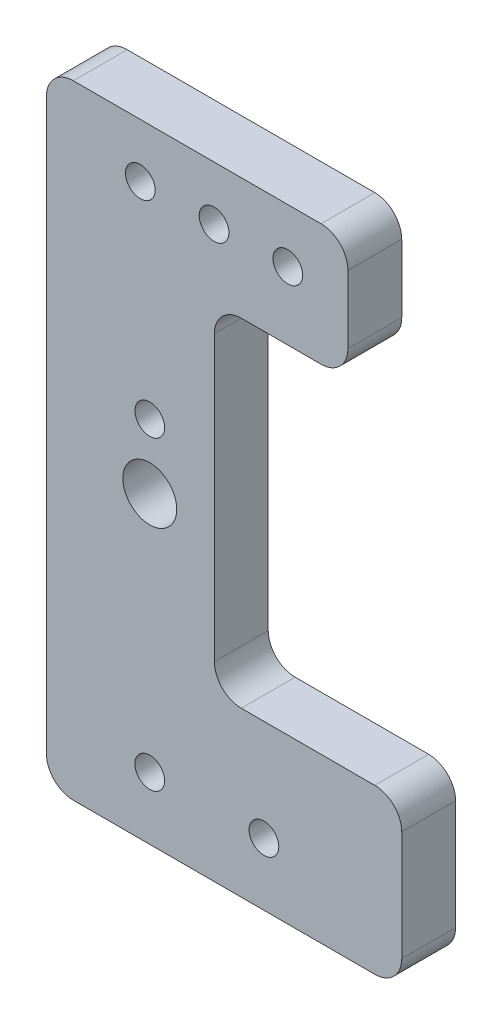
ISO-10303-21;
HEADER;
FILE_DESCRIPTION(('STEP AP214'),'2;1');
FILE_NAME('part.step','',(''),(''),'','','');
FILE_SCHEMA(('AUTOMOTIVE_DESIGN { 1 0 10303 214 1 1 1 1 }'));
ENDSEC;
DATA;
#1=APPLICATION_CONTEXT('core data for automotive mechanical design processes');
#2=APPLICATION_PROTOCOL_DEFINITION('international standard','automotive_design',2000,#1);
#3=PRODUCT_CONTEXT('',#1,'mechanical');
#4=PRODUCT('Part','Part','',(#3));
#5=PRODUCT_RELATED_PRODUCT_CATEGORY('part','',(#4));
#6=PRODUCT_DEFINITION_FORMATION('','',#4);
#7=PRODUCT_DEFINITION_CONTEXT('part definition',#1,'design');
#8=PRODUCT_DEFINITION('design','',#6,#7);
#9=PRODUCT_DEFINITION_SHAPE('','',#8);
#10=(LENGTH_UNIT() NAMED_UNIT(*) SI_UNIT(.MILLI.,.METRE.));
#11=(NAMED_UNIT(*) PLANE_ANGLE_UNIT() SI_UNIT($,.RADIAN.));
#12=(NAMED_UNIT(*) SI_UNIT($,.STERADIAN.) SOLID_ANGLE_UNIT());
#13=UNCERTAINTY_MEASURE_WITH_UNIT(LENGTH_MEASURE(1.E-05),#10,'distance_accuracy_value','');
#14=(GEOMETRIC_REPRESENTATION_CONTEXT(3) GLOBAL_UNCERTAINTY_ASSIGNED_CONTEXT((#13)) GLOBAL_UNIT_ASSIGNED_CONTEXT((#10,
#11,#12)) REPRESENTATION_CONTEXT('',''));
#15=CARTESIAN_POINT('',(0.,0.,0.));
#16=DIRECTION('',(0.,0.,1.));
#17=DIRECTION('',(1.,0.,0.));
#18=AXIS2_PLACEMENT_3D('',#15,#16,#17);
#19=CARTESIAN_POINT('',(-16.5989,4.134993,3.175));
#20=DIRECTION('',(0.,0.,-1.));
#21=DIRECTION('',(-1.,0.,0.));
#22=AXIS2_PLACEMENT_3D('',#19,#20,#21);
#23=PLANE('',#22);
#24=CARTESIAN_POINT('',(-16.5989,4.134993,3.175));
#25=DIRECTION('',(0.,0.,1.));
#26=DIRECTION('',(-1.,0.,0.));
#27=AXIS2_PLACEMENT_3D('',#24,#25,#26);
#28=CIRCLE('',#27,3.175);
#29=CARTESIAN_POINT('',(-16.5989,7.309993,3.175));
#30=VERTEX_POINT('',#29);
#31=CARTESIAN_POINT('',(-19.7739,4.134993,3.175));
#32=VERTEX_POINT('',#31);
#33=EDGE_CURVE('E261',#30,#32,#28,.T.);
#34=ORIENTED_EDGE('',*,*,#33,.T.);
#35=DIRECTION('',(0.,-1.,0.));
#36=VECTOR('',#35,1.);
#37=CARTESIAN_POINT('',(-19.7739,-63.0079231904116,3.175));
#38=LINE('',#37,#36);
#39=CARTESIAN_POINT('',(-19.7739,-63.0079231904116,3.175));
#40=VERTEX_POINT('',#39);
#41=EDGE_CURVE('E138',#32,#40,#38,.T.);
#42=ORIENTED_EDGE('',*,*,#41,.T.);
#43=CARTESIAN_POINT('',(-16.5989,-63.0079231904116,3.175));
#44=DIRECTION('',(0.,0.,1.));
#45=DIRECTION('',(1.,0.,0.));
#46=AXIS2_PLACEMENT_3D('',#43,#44,#45);
#47=CIRCLE('',#46,3.175);
#48=CARTESIAN_POINT('',(-16.5989,-66.1829231904116,3.175));
#49=VERTEX_POINT('',#48);
#50=EDGE_CURVE('E313',#40,#49,#47,.T.);
#51=ORIENTED_EDGE('',*,*,#50,.T.);
#52=DIRECTION('',(1.,0.,0.));
#53=VECTOR('',#52,1.);
#54=CARTESIAN_POINT('',(18.9611,-66.1829231904116,3.175));
#55=LINE('',#54,#53);
#56=CARTESIAN_POINT('',(18.9611,-66.1829231904116,3.175));
#57=VERTEX_POINT('',#56);
#58=EDGE_CURVE('E333',#49,#57,#55,.T.);
#59=ORIENTED_EDGE('',*,*,#58,.T.);
#60=CARTESIAN_POINT('',(18.9611,-63.0079231904116,3.175));
#61=DIRECTION('',(0.,0.,1.));
#62=DIRECTION('',(1.,0.,0.));
#63=AXIS2_PLACEMENT_3D('',#60,#61,#62);
#64=CIRCLE('',#63,3.175);
#65=CARTESIAN_POINT('',(22.1361,-63.0079231904116,3.175));
#66=VERTEX_POINT('',#65);
#67=EDGE_CURVE('E329',#57,#66,#64,.T.);
#68=ORIENTED_EDGE('',*,*,#67,.T.);
#69=DIRECTION('',(0.,1.,0.));
#70=VECTOR('',#69,1.);
#71=CARTESIAN_POINT('',(22.1361,-50.0539231904116,3.175));
#72=LINE('',#71,#70);
#73=CARTESIAN_POINT('',(22.1361,-50.0539231904116,3.175));
#74=VERTEX_POINT('',#73);
#75=EDGE_CURVE('E332',#66,#74,#72,.T.);
#76=ORIENTED_EDGE('',*,*,#75,.T.);
#77=CARTESIAN_POINT('',(18.9611,-50.0539231904116,3.175));
#78=DIRECTION('',(0.,0.,1.));
#79=DIRECTION('',(1.,0.,0.));
#80=AXIS2_PLACEMENT_3D('',#77,#78,#79);
#81=CIRCLE('',#80,3.175);
#82=CARTESIAN_POINT('',(18.9611,-46.8789231904116,3.175));
#83=VERTEX_POINT('',#82);
#84=EDGE_CURVE('E336',#74,#83,#81,.T.);
#85=ORIENTED_EDGE('',*,*,#84,.T.);
#86=DIRECTION('',(-1.,0.,0.));
#87=VECTOR('',#86,1.);
#88=CARTESIAN_POINT('',(3.2131,-46.8789231904116,3.175));
#89=LINE('',#88,#87);
#90=CARTESIAN_POINT('',(3.2131,-46.8789231904116,3.175));
#91=VERTEX_POINT('',#90);
#92=EDGE_CURVE('E344',#83,#91,#89,.T.);
#93=ORIENTED_EDGE('',*,*,#92,.T.);
#94=CARTESIAN_POINT('',(3.2131,-43.7039231904117,3.175));
#95=DIRECTION('',(0.,0.,-1.));
#96=DIRECTION('',(-1.,0.,0.));
#97=AXIS2_PLACEMENT_3D('',#94,#95,#96);
#98=CIRCLE('',#97,3.175);
#99=CARTESIAN_POINT('',(0.0381000000000044,-43.7039231904117,3.175));
#100=VERTEX_POINT('',#99);
#101=EDGE_CURVE('E347',#91,#100,#98,.T.);
#102=ORIENTED_EDGE('',*,*,#101,.T.);
#103=DIRECTION('',(0.,1.,0.));
#104=VECTOR('',#103,1.);
#105=CARTESIAN_POINT('',(0.0380999999999992,-10.21446036835,3.175));
#106=LINE('',#105,#104);
#107=CARTESIAN_POINT('',(0.0380999999999992,-10.21446036835,3.175));
#108=VERTEX_POINT('',#107);
#109=EDGE_CURVE('E350',#100,#108,#106,.T.);
#110=ORIENTED_EDGE('',*,*,#109,.T.);
#111=CARTESIAN_POINT('',(3.2131,-10.21446036835,3.175));
#112=DIRECTION('',(0.,0.,-1.));
#113=DIRECTION('',(1.,0.,0.));
#114=AXIS2_PLACEMENT_3D('',#111,#112,#113);
#115=CIRCLE('',#114,3.175);
#116=CARTESIAN_POINT('',(3.2131,-7.03946036835002,3.175));
#117=VERTEX_POINT('',#116);
#118=EDGE_CURVE('E353',#108,#117,#115,.T.);
#119=ORIENTED_EDGE('',*,*,#118,.T.);
#120=DIRECTION('',(1.,0.,0.));
#121=VECTOR('',#120,1.);
#122=CARTESIAN_POINT('',(12.6111,-7.03946036835002,3.175));
#123=LINE('',#122,#121);
#124=CARTESIAN_POINT('',(12.6111,-7.03946036835002,3.175));
#125=VERTEX_POINT('',#124);
#126=EDGE_CURVE('E356',#117,#125,#123,.T.);
#127=ORIENTED_EDGE('',*,*,#126,.T.);
#128=CARTESIAN_POINT('',(12.6111,-3.86446036835002,3.175));
#129=DIRECTION('',(0.,0.,1.));
#130=DIRECTION('',(-1.,0.,0.));
#131=AXIS2_PLACEMENT_3D('',#128,#129,#130);
#132=CIRCLE('',#131,3.175);
#133=CARTESIAN_POINT('',(15.7861,-3.86446036835002,3.175));
#134=VERTEX_POINT('',#133);
#135=EDGE_CURVE('E193',#125,#134,#132,.T.);
#136=ORIENTED_EDGE('',*,*,#135,.T.);
#137=DIRECTION('',(0.,1.,0.));
#138=VECTOR('',#137,1.);
#139=CARTESIAN_POINT('',(15.7861,4.134993,3.175));
#140=LINE('',#139,#138);
#141=CARTESIAN_POINT('',(15.7861,4.134993,3.175));
#142=VERTEX_POINT('',#141);
#143=EDGE_CURVE('E187',#134,#142,#140,.T.);
#144=ORIENTED_EDGE('',*,*,#143,.T.);
#145=CARTESIAN_POINT('',(12.6111,4.134993,3.175));
#146=DIRECTION('',(0.,0.,1.));
#147=DIRECTION('',(1.,0.,0.));
#148=AXIS2_PLACEMENT_3D('',#145,#146,#147);
#149=CIRCLE('',#148,3.175);
#150=CARTESIAN_POINT('',(12.6111,7.309993,3.175));
#151=VERTEX_POINT('',#150);
#152=EDGE_CURVE('E191',#142,#151,#149,.T.);
#153=ORIENTED_EDGE('',*,*,#152,.T.);
#154=DIRECTION('',(-1.,0.,0.));
#155=VECTOR('',#154,1.);
#156=CARTESIAN_POINT('',(-16.5989,7.309993,3.175));
#157=LINE('',#156,#155);
#158=EDGE_CURVE('E56',#151,#30,#157,.T.);
#159=ORIENTED_EDGE('',*,*,#158,.T.);
#160=EDGE_LOOP('',(#34,#42,#51,#59,#68,#76,#85,#93,#102,#110,#119,#127,#136,#144,#153,#159));
#161=FACE_BOUND('',#160,.T.);
#162=CARTESIAN_POINT('',(-8.6995,0.959992999999999,3.175));
#163=DIRECTION('',(0.,0.,1.));
#164=DIRECTION('',(1.,0.,0.));
#165=AXIS2_PLACEMENT_3D('',#162,#163,#164);
#166=CIRCLE('',#165,1.7526);
#167=CARTESIAN_POINT('',(-6.9469,0.959992999999999,3.175));
#168=VERTEX_POINT('',#167);
#169=EDGE_CURVE('E221',#168,#168,#166,.T.);
#170=ORIENTED_EDGE('',*,*,#169,.F.);
#171=EDGE_LOOP('',(#170));
#172=FACE_BOUND('',#171,.T.);
#173=CARTESIAN_POINT('',(8.6995,0.959992999999999,3.175));
#174=DIRECTION('',(0.,0.,1.));
#175=DIRECTION('',(1.,0.,0.));
#176=AXIS2_PLACEMENT_3D('',#173,#174,#175);
#177=CIRCLE('',#176,1.7526);
#178=CARTESIAN_POINT('',(10.4521,0.959992999999999,3.175));
#179=VERTEX_POINT('',#178);
#180=EDGE_CURVE('E397',#179,#179,#177,.T.);
#181=ORIENTED_EDGE('',*,*,#180,.F.);
#182=EDGE_LOOP('',(#181));
#183=FACE_BOUND('',#182,.T.);
#184=CARTESIAN_POINT('',(-7.58190000000001,-30.3689231904116,3.175));
#185=DIRECTION('',(0.,0.,1.));
#186=DIRECTION('',(1.,0.,0.));
#187=AXIS2_PLACEMENT_3D('',#184,#185,#186);
#188=CIRCLE('',#187,3.175);
#189=CARTESIAN_POINT('',(-4.40690000000001,-30.3689231904116,3.175));
#190=VERTEX_POINT('',#189);
#191=EDGE_CURVE('E363',#190,#190,#188,.T.);
#192=ORIENTED_EDGE('',*,*,#191,.F.);
#193=EDGE_LOOP('',(#192));
#194=FACE_BOUND('',#193,.T.);
#195=CARTESIAN_POINT('',(-7.58190000000001,-22.7489231904116,3.175));
#196=DIRECTION('',(0.,0.,1.));
#197=DIRECTION('',(1.,0.,0.));
#198=AXIS2_PLACEMENT_3D('',#195,#196,#197);
#199=CIRCLE('',#198,1.7526);
#200=CARTESIAN_POINT('',(-5.82930000000001,-22.7489231904116,3.175));
#201=VERTEX_POINT('',#200);
#202=EDGE_CURVE('E364',#201,#201,#199,.T.);
#203=ORIENTED_EDGE('',*,*,#202,.F.);
#204=EDGE_LOOP('',(#203));
#205=FACE_BOUND('',#204,.T.);
#206=CARTESIAN_POINT('',(-7.5819,-58.8169231904116,3.175));
#207=DIRECTION('',(0.,0.,1.));
#208=DIRECTION('',(1.,0.,0.));
#209=AXIS2_PLACEMENT_3D('',#206,#207,#208);
#210=CIRCLE('',#209,1.7526);
#211=CARTESIAN_POINT('',(-5.8293,-58.8169231904116,3.175));
#212=VERTEX_POINT('',#211);
#213=EDGE_CURVE('E369',#212,#212,#210,.T.);
#214=ORIENTED_EDGE('',*,*,#213,.F.);
#215=EDGE_LOOP('',(#214));
#216=FACE_BOUND('',#215,.T.);
#217=CARTESIAN_POINT('',(5.8801,-58.8169231904116,3.175));
#218=DIRECTION('',(0.,0.,1.));
#219=DIRECTION('',(1.,0.,0.));
#220=AXIS2_PLACEMENT_3D('',#217,#218,#219);
#221=CIRCLE('',#220,1.7526);
#222=CARTESIAN_POINT('',(7.6327,-58.8169231904116,3.175));
#223=VERTEX_POINT('',#222);
#224=EDGE_CURVE('E376',#223,#223,#221,.T.);
#225=ORIENTED_EDGE('',*,*,#224,.F.);
#226=EDGE_LOOP('',(#225));
#227=FACE_BOUND('',#226,.T.);
#228=CARTESIAN_POINT('',(0.,0.959992999999999,3.175));
#229=DIRECTION('',(0.,0.,1.));
#230=DIRECTION('',(1.,0.,0.));
#231=AXIS2_PLACEMENT_3D('',#228,#229,#230);
#232=CIRCLE('',#231,1.7526);
#233=CARTESIAN_POINT('',(1.7526,0.959992999999999,3.175));
#234=VERTEX_POINT('',#233);
#235=EDGE_CURVE('E383',#234,#234,#232,.T.);
#236=ORIENTED_EDGE('',*,*,#235,.F.);
#237=EDGE_LOOP('',(#236));
#238=FACE_BOUND('',#237,.T.);
#239=ADVANCED_FACE('F38',(#161,#172,#183,#194,#205,#216,#227,#238),#23,.F.);
#240=CARTESIAN_POINT('',(-16.5989,4.134993,-3.175));
#241=DIRECTION('',(0.,0.,-1.));
#242=DIRECTION('',(-1.,0.,0.));
#243=AXIS2_PLACEMENT_3D('',#240,#241,#242);
#244=PLANE('',#243);
#245=CARTESIAN_POINT('',(5.8801,-58.8169231904116,-3.175));
#246=DIRECTION('',(0.,0.,1.));
#247=DIRECTION('',(1.,0.,0.));
#248=AXIS2_PLACEMENT_3D('',#245,#246,#247);
#249=CIRCLE('',#248,1.7526);
#250=CARTESIAN_POINT('',(7.6327,-58.8169231904116,-3.175));
#251=VERTEX_POINT('',#250);
#252=EDGE_CURVE('E380',#251,#251,#249,.T.);
#253=ORIENTED_EDGE('',*,*,#252,.T.);
#254=EDGE_LOOP('',(#253));
#255=FACE_BOUND('',#254,.T.);
#256=CARTESIAN_POINT('',(-7.58190000000001,-22.7489231904116,-3.175));
#257=DIRECTION('',(0.,0.,1.));
#258=DIRECTION('',(1.,0.,0.));
#259=AXIS2_PLACEMENT_3D('',#256,#257,#258);
#260=CIRCLE('',#259,1.7526);
#261=CARTESIAN_POINT('',(-5.82930000000001,-22.7489231904116,-3.175));
#262=VERTEX_POINT('',#261);
#263=EDGE_CURVE('E366',#262,#262,#260,.T.);
#264=ORIENTED_EDGE('',*,*,#263,.T.);
#265=EDGE_LOOP('',(#264));
#266=FACE_BOUND('',#265,.T.);
#267=CARTESIAN_POINT('',(8.6995,0.959992999999999,-3.175));
#268=DIRECTION('',(0.,0.,1.));
#269=DIRECTION('',(1.,0.,0.));
#270=AXIS2_PLACEMENT_3D('',#267,#268,#269);
#271=CIRCLE('',#270,1.7526);
#272=CARTESIAN_POINT('',(10.4521,0.959992999999999,-3.175));
#273=VERTEX_POINT('',#272);
#274=EDGE_CURVE('E395',#273,#273,#271,.T.);
#275=ORIENTED_EDGE('',*,*,#274,.T.);
#276=EDGE_LOOP('',(#275));
#277=FACE_BOUND('',#276,.T.);
#278=CARTESIAN_POINT('',(-16.5989,4.134993,-3.175));
#279=DIRECTION('',(0.,0.,1.));
#280=DIRECTION('',(-1.,0.,0.));
#281=AXIS2_PLACEMENT_3D('',#278,#279,#280);
#282=CIRCLE('',#281,3.175);
#283=CARTESIAN_POINT('',(-16.5989,7.309993,-3.175));
#284=VERTEX_POINT('',#283);
#285=CARTESIAN_POINT('',(-19.7739,4.134993,-3.175));
#286=VERTEX_POINT('',#285);
#287=EDGE_CURVE('E216',#284,#286,#282,.T.);
#288=ORIENTED_EDGE('',*,*,#287,.F.);
#289=DIRECTION('',(-1.,0.,0.));
#290=VECTOR('',#289,1.);
#291=CARTESIAN_POINT('',(-16.5989,7.309993,-3.175));
#292=LINE('',#291,#290);
#293=CARTESIAN_POINT('',(12.6111,7.309993,-3.175));
#294=VERTEX_POINT('',#293);
#295=EDGE_CURVE('E130',#294,#284,#292,.T.);
#296=ORIENTED_EDGE('',*,*,#295,.F.);
#297=CARTESIAN_POINT('',(12.6111,4.134993,-3.175));
#298=DIRECTION('',(0.,0.,1.));
#299=DIRECTION('',(1.,0.,0.));
#300=AXIS2_PLACEMENT_3D('',#297,#298,#299);
#301=CIRCLE('',#300,3.175);
#302=CARTESIAN_POINT('',(15.7861,4.134993,-3.175));
#303=VERTEX_POINT('',#302);
#304=EDGE_CURVE('E124',#303,#294,#301,.T.);
#305=ORIENTED_EDGE('',*,*,#304,.F.);
#306=DIRECTION('',(0.,1.,0.));
#307=VECTOR('',#306,1.);
#308=CARTESIAN_POINT('',(15.7861,4.134993,-3.175));
#309=LINE('',#308,#307);
#310=CARTESIAN_POINT('',(15.7861,-3.86446036835002,-3.175));
#311=VERTEX_POINT('',#310);
#312=EDGE_CURVE('E202',#311,#303,#309,.T.);
#313=ORIENTED_EDGE('',*,*,#312,.F.);
#314=CARTESIAN_POINT('',(12.6111,-3.86446036835002,-3.175));
#315=DIRECTION('',(0.,0.,1.));
#316=DIRECTION('',(-1.,0.,0.));
#317=AXIS2_PLACEMENT_3D('',#314,#315,#316);
#318=CIRCLE('',#317,3.175);
#319=CARTESIAN_POINT('',(12.6111,-7.03946036835002,-3.175));
#320=VERTEX_POINT('',#319);
#321=EDGE_CURVE('E253',#320,#311,#318,.T.);
#322=ORIENTED_EDGE('',*,*,#321,.F.);
#323=DIRECTION('',(1.,0.,0.));
#324=VECTOR('',#323,1.);
#325=CARTESIAN_POINT('',(12.6111,-7.03946036835002,-3.175));
#326=LINE('',#325,#324);
#327=CARTESIAN_POINT('',(3.2131,-7.03946036835002,-3.175));
#328=VERTEX_POINT('',#327);
#329=EDGE_CURVE('E250',#328,#320,#326,.T.);
#330=ORIENTED_EDGE('',*,*,#329,.F.);
#331=CARTESIAN_POINT('',(3.2131,-10.21446036835,-3.175));
#332=DIRECTION('',(0.,0.,-1.));
#333=DIRECTION('',(1.,0.,0.));
#334=AXIS2_PLACEMENT_3D('',#331,#332,#333);
#335=CIRCLE('',#334,3.175);
#336=CARTESIAN_POINT('',(0.0380999999999992,-10.21446036835,-3.175));
#337=VERTEX_POINT('',#336);
#338=EDGE_CURVE('E247',#337,#328,#335,.T.);
#339=ORIENTED_EDGE('',*,*,#338,.F.);
#340=DIRECTION('',(0.,1.,0.));
#341=VECTOR('',#340,1.);
#342=CARTESIAN_POINT('',(0.0380999999999992,-10.21446036835,-3.175));
#343=LINE('',#342,#341);
#344=CARTESIAN_POINT('',(0.0381000000000044,-43.7039231904117,-3.175));
#345=VERTEX_POINT('',#344);
#346=EDGE_CURVE('E244',#345,#337,#343,.T.);
#347=ORIENTED_EDGE('',*,*,#346,.F.);
#348=CARTESIAN_POINT('',(3.2131,-43.7039231904117,-3.175));
#349=DIRECTION('',(0.,0.,-1.));
#350=DIRECTION('',(-1.,0.,0.));
#351=AXIS2_PLACEMENT_3D('',#348,#349,#350);
#352=CIRCLE('',#351,3.175);
#353=CARTESIAN_POINT('',(3.2131,-46.8789231904116,-3.175));
#354=VERTEX_POINT('',#353);
#355=EDGE_CURVE('E241',#354,#345,#352,.T.);
#356=ORIENTED_EDGE('',*,*,#355,.F.);
#357=DIRECTION('',(-1.,0.,0.));
#358=VECTOR('',#357,1.);
#359=CARTESIAN_POINT('',(3.2131,-46.8789231904116,-3.175));
#360=LINE('',#359,#358);
#361=CARTESIAN_POINT('',(18.9611,-46.8789231904116,-3.175));
#362=VERTEX_POINT('',#361);
#363=EDGE_CURVE('E238',#362,#354,#360,.T.);
#364=ORIENTED_EDGE('',*,*,#363,.F.);
#365=CARTESIAN_POINT('',(18.9611,-50.0539231904116,-3.175));
#366=DIRECTION('',(0.,0.,1.));
#367=DIRECTION('',(1.,0.,0.));
#368=AXIS2_PLACEMENT_3D('',#365,#366,#367);
#369=CIRCLE('',#368,3.175);
#370=CARTESIAN_POINT('',(22.1361,-50.0539231904116,-3.175));
#371=VERTEX_POINT('',#370);
#372=EDGE_CURVE('E235',#371,#362,#369,.T.);
#373=ORIENTED_EDGE('',*,*,#372,.F.);
#374=DIRECTION('',(0.,1.,0.));
#375=VECTOR('',#374,1.);
#376=CARTESIAN_POINT('',(22.1361,-50.0539231904116,-3.175));
#377=LINE('',#376,#375);
#378=CARTESIAN_POINT('',(22.1361,-63.0079231904116,-3.175));
#379=VERTEX_POINT('',#378);
#380=EDGE_CURVE('E233',#379,#371,#377,.T.);
#381=ORIENTED_EDGE('',*,*,#380,.F.);
#382=CARTESIAN_POINT('',(18.9611,-63.0079231904116,-3.175));
#383=DIRECTION('',(0.,0.,1.));
#384=DIRECTION('',(1.,0.,0.));
#385=AXIS2_PLACEMENT_3D('',#382,#383,#384);
#386=CIRCLE('',#385,3.175);
#387=CARTESIAN_POINT('',(18.9611,-66.1829231904116,-3.175));
#388=VERTEX_POINT('',#387);
#389=EDGE_CURVE('E230',#388,#379,#386,.T.);
#390=ORIENTED_EDGE('',*,*,#389,.F.);
#391=DIRECTION('',(1.,0.,0.));
#392=VECTOR('',#391,1.);
#393=CARTESIAN_POINT('',(18.9611,-66.1829231904116,-3.175));
#394=LINE('',#393,#392);
#395=CARTESIAN_POINT('',(-16.5989,-66.1829231904116,-3.175));
#396=VERTEX_POINT('',#395);
#397=EDGE_CURVE('E227',#396,#388,#394,.T.);
#398=ORIENTED_EDGE('',*,*,#397,.F.);
#399=CARTESIAN_POINT('',(-16.5989,-63.0079231904116,-3.175));
#400=DIRECTION('',(0.,0.,1.));
#401=DIRECTION('',(1.,0.,0.));
#402=AXIS2_PLACEMENT_3D('',#399,#400,#401);
#403=CIRCLE('',#402,3.175);
#404=CARTESIAN_POINT('',(-19.7739,-63.0079231904116,-3.175));
#405=VERTEX_POINT('',#404);
#406=EDGE_CURVE('E224',#405,#396,#403,.T.);
#407=ORIENTED_EDGE('',*,*,#406,.F.);
#408=DIRECTION('',(0.,-1.,0.));
#409=VECTOR('',#408,1.);
#410=CARTESIAN_POINT('',(-19.7739,-63.0079231904116,-3.175));
#411=LINE('',#410,#409);
#412=EDGE_CURVE('E220',#286,#405,#411,.T.);
#413=ORIENTED_EDGE('',*,*,#412,.F.);
#414=EDGE_LOOP('',(#288,#296,#305,#313,#322,#330,#339,#347,#356,#364,#373,#381,#390,#398,#407,#413));
#415=FACE_BOUND('',#414,.T.);
#416=CARTESIAN_POINT('',(-8.6995,0.959992999999999,-3.175));
#417=DIRECTION('',(0.,0.,1.));
#418=DIRECTION('',(1.,0.,0.));
#419=AXIS2_PLACEMENT_3D('',#416,#417,#418);
#420=CIRCLE('',#419,1.7526);
#421=CARTESIAN_POINT('',(-6.9469,0.959992999999999,-3.175));
#422=VERTEX_POINT('',#421);
#423=EDGE_CURVE('E401',#422,#422,#420,.T.);
#424=ORIENTED_EDGE('',*,*,#423,.T.);
#425=EDGE_LOOP('',(#424));
#426=FACE_BOUND('',#425,.T.);
#427=CARTESIAN_POINT('',(-7.58190000000001,-30.3689231904116,-3.175));
#428=DIRECTION('',(0.,0.,1.));
#429=DIRECTION('',(1.,0.,0.));
#430=AXIS2_PLACEMENT_3D('',#427,#428,#429);
#431=CIRCLE('',#430,3.175);
#432=CARTESIAN_POINT('',(-4.40690000000001,-30.3689231904116,-3.175));
#433=VERTEX_POINT('',#432);
#434=EDGE_CURVE('E360',#433,#433,#431,.T.);
#435=ORIENTED_EDGE('',*,*,#434,.T.);
#436=EDGE_LOOP('',(#435));
#437=FACE_BOUND('',#436,.T.);
#438=CARTESIAN_POINT('',(-7.5819,-58.8169231904116,-3.175));
#439=DIRECTION('',(0.,0.,1.));
#440=DIRECTION('',(1.,0.,0.));
#441=AXIS2_PLACEMENT_3D('',#438,#439,#440);
#442=CIRCLE('',#441,1.7526);
#443=CARTESIAN_POINT('',(-5.8293,-58.8169231904116,-3.175));
#444=VERTEX_POINT('',#443);
#445=EDGE_CURVE('E379',#444,#444,#442,.T.);
#446=ORIENTED_EDGE('',*,*,#445,.T.);
#447=EDGE_LOOP('',(#446));
#448=FACE_BOUND('',#447,.T.);
#449=CARTESIAN_POINT('',(0.,0.959992999999999,-3.175));
#450=DIRECTION('',(0.,0.,1.));
#451=DIRECTION('',(1.,0.,0.));
#452=AXIS2_PLACEMENT_3D('',#449,#450,#451);
#453=CIRCLE('',#452,1.7526);
#454=CARTESIAN_POINT('',(1.7526,0.959992999999999,-3.175));
#455=VERTEX_POINT('',#454);
#456=EDGE_CURVE('E657',#455,#455,#453,.T.);
#457=ORIENTED_EDGE('',*,*,#456,.T.);
#458=EDGE_LOOP('',(#457));
#459=FACE_BOUND('',#458,.T.);
#460=ADVANCED_FACE('F317',(#255,#266,#277,#415,#426,#437,#448,#459),#244,.T.);
#461=CARTESIAN_POINT('',(-16.5989,4.134993,3.175));
#462=DIRECTION('',(0.,0.,-1.));
#463=DIRECTION('',(-1.,0.,0.));
#464=AXIS2_PLACEMENT_3D('',#461,#462,#463);
#465=CYLINDRICAL_SURFACE('',#464,3.175);
#466=ORIENTED_EDGE('',*,*,#287,.T.);
#467=DIRECTION('',(0.,0.,-1.));
#468=VECTOR('',#467,1.);
#469=CARTESIAN_POINT('',(-19.7739,4.134993,3.175));
#470=LINE('',#469,#468);
#471=EDGE_CURVE('E11',#32,#286,#470,.T.);
#472=ORIENTED_EDGE('',*,*,#471,.F.);
#473=ORIENTED_EDGE('',*,*,#33,.F.);
#474=DIRECTION('',(0.,0.,-1.));
#475=VECTOR('',#474,1.);
#476=CARTESIAN_POINT('',(-16.5989,7.309993,3.175));
#477=LINE('',#476,#475);
#478=EDGE_CURVE('E212',#30,#284,#477,.T.);
#479=ORIENTED_EDGE('',*,*,#478,.T.);
#480=EDGE_LOOP('',(#466,#472,#473,#479));
#481=FACE_BOUND('',#480,.T.);
#482=ADVANCED_FACE('F40',(#481),#465,.T.);
#483=CARTESIAN_POINT('',(-19.7739,-63.0079231904116,3.175));
#484=DIRECTION('',(1.,0.,0.));
#485=DIRECTION('',(0.,1.,0.));
#486=AXIS2_PLACEMENT_3D('',#483,#484,#485);
#487=PLANE('',#486);
#488=ORIENTED_EDGE('',*,*,#412,.T.);
#489=DIRECTION('',(0.,0.,-1.));
#490=VECTOR('',#489,1.);
#491=CARTESIAN_POINT('',(-19.7739,-63.0079231904116,3.175));
#492=LINE('',#491,#490);
#493=EDGE_CURVE('E48',#40,#405,#492,.T.);
#494=ORIENTED_EDGE('',*,*,#493,.F.);
#495=ORIENTED_EDGE('',*,*,#41,.F.);
#496=ORIENTED_EDGE('',*,*,#471,.T.);
#497=EDGE_LOOP('',(#488,#494,#495,#496));
#498=FACE_BOUND('',#497,.T.);
#499=ADVANCED_FACE('F414',(#498),#487,.F.);
#500=CARTESIAN_POINT('',(-16.5989,-63.0079231904116,3.175));
#501=DIRECTION('',(0.,0.,-1.));
#502=DIRECTION('',(-1.,0.,0.));
#503=AXIS2_PLACEMENT_3D('',#500,#501,#502);
#504=CYLINDRICAL_SURFACE('',#503,3.175);
#505=ORIENTED_EDGE('',*,*,#406,.T.);
#506=DIRECTION('',(0.,0.,-1.));
#507=VECTOR('',#506,1.);
#508=CARTESIAN_POINT('',(-16.5989,-66.1829231904116,3.175));
#509=LINE('',#508,#507);
#510=EDGE_CURVE('E302',#49,#396,#509,.T.);
#511=ORIENTED_EDGE('',*,*,#510,.F.);
#512=ORIENTED_EDGE('',*,*,#50,.F.);
#513=ORIENTED_EDGE('',*,*,#493,.T.);
#514=EDGE_LOOP('',(#505,#511,#512,#513));
#515=FACE_BOUND('',#514,.T.);
#516=ADVANCED_FACE('F311',(#515),#504,.T.);
#517=CARTESIAN_POINT('',(18.9611,-66.1829231904116,3.175));
#518=DIRECTION('',(0.,1.,0.));
#519=DIRECTION('',(0.,0.,1.));
#520=AXIS2_PLACEMENT_3D('',#517,#518,#519);
#521=PLANE('',#520);
#522=ORIENTED_EDGE('',*,*,#397,.T.);
#523=DIRECTION('',(0.,0.,-1.));
#524=VECTOR('',#523,1.);
#525=CARTESIAN_POINT('',(18.9611,-66.1829231904116,3.175));
#526=LINE('',#525,#524);
#527=EDGE_CURVE('E298',#57,#388,#526,.T.);
#528=ORIENTED_EDGE('',*,*,#527,.F.);
#529=ORIENTED_EDGE('',*,*,#58,.F.);
#530=ORIENTED_EDGE('',*,*,#510,.T.);
#531=EDGE_LOOP('',(#522,#528,#529,#530));
#532=FACE_BOUND('',#531,.T.);
#533=ADVANCED_FACE('F323',(#532),#521,.F.);
#534=CARTESIAN_POINT('',(18.9611,-63.0079231904116,3.175));
#535=DIRECTION('',(0.,0.,-1.));
#536=DIRECTION('',(-1.,0.,0.));
#537=AXIS2_PLACEMENT_3D('',#534,#535,#536);
#538=CYLINDRICAL_SURFACE('',#537,3.175);
#539=ORIENTED_EDGE('',*,*,#389,.T.);
#540=DIRECTION('',(0.,0.,-1.));
#541=VECTOR('',#540,1.);
#542=CARTESIAN_POINT('',(22.1361,-63.0079231904116,3.175));
#543=LINE('',#542,#541);
#544=EDGE_CURVE('E295',#66,#379,#543,.T.);
#545=ORIENTED_EDGE('',*,*,#544,.F.);
#546=ORIENTED_EDGE('',*,*,#67,.F.);
#547=ORIENTED_EDGE('',*,*,#527,.T.);
#548=EDGE_LOOP('',(#539,#545,#546,#547));
#549=FACE_BOUND('',#548,.T.);
#550=ADVANCED_FACE('F327',(#549),#538,.T.);
#551=CARTESIAN_POINT('',(22.1361,-50.0539231904116,3.175));
#552=DIRECTION('',(-1.,0.,0.));
#553=DIRECTION('',(0.,-1.,0.));
#554=AXIS2_PLACEMENT_3D('',#551,#552,#553);
#555=PLANE('',#554);
#556=ORIENTED_EDGE('',*,*,#380,.T.);
#557=DIRECTION('',(0.,0.,-1.));
#558=VECTOR('',#557,1.);
#559=CARTESIAN_POINT('',(22.1361,-50.0539231904116,3.175));
#560=LINE('',#559,#558);
#561=EDGE_CURVE('E291',#74,#371,#560,.T.);
#562=ORIENTED_EDGE('',*,*,#561,.F.);
#563=ORIENTED_EDGE('',*,*,#75,.F.);
#564=ORIENTED_EDGE('',*,*,#544,.T.);
#565=EDGE_LOOP('',(#556,#562,#563,#564));
#566=FACE_BOUND('',#565,.T.);
#567=ADVANCED_FACE('F466',(#566),#555,.F.);
#568=CARTESIAN_POINT('',(18.9611,-50.0539231904116,3.175));
#569=DIRECTION('',(0.,0.,-1.));
#570=DIRECTION('',(-1.,0.,0.));
#571=AXIS2_PLACEMENT_3D('',#568,#569,#570);
#572=CYLINDRICAL_SURFACE('',#571,3.175);
#573=ORIENTED_EDGE('',*,*,#372,.T.);
#574=DIRECTION('',(0.,0.,-1.));
#575=VECTOR('',#574,1.);
#576=CARTESIAN_POINT('',(18.9611,-46.8789231904116,3.175));
#577=LINE('',#576,#575);
#578=EDGE_CURVE('E287',#83,#362,#577,.T.);
#579=ORIENTED_EDGE('',*,*,#578,.F.);
#580=ORIENTED_EDGE('',*,*,#84,.F.);
#581=ORIENTED_EDGE('',*,*,#561,.T.);
#582=EDGE_LOOP('',(#573,#579,#580,#581));
#583=FACE_BOUND('',#582,.T.);
#584=ADVANCED_FACE('F462',(#583),#572,.T.);
#585=CARTESIAN_POINT('',(3.2131,-46.8789231904116,3.175));
#586=DIRECTION('',(0.,-1.,0.));
#587=DIRECTION('',(1.,0.,0.));
#588=AXIS2_PLACEMENT_3D('',#585,#586,#587);
#589=PLANE('',#588);
#590=ORIENTED_EDGE('',*,*,#363,.T.);
#591=DIRECTION('',(0.,0.,-1.));
#592=VECTOR('',#591,1.);
#593=CARTESIAN_POINT('',(3.2131,-46.8789231904116,3.175));
#594=LINE('',#593,#592);
#595=EDGE_CURVE('E283',#91,#354,#594,.T.);
#596=ORIENTED_EDGE('',*,*,#595,.F.);
#597=ORIENTED_EDGE('',*,*,#92,.F.);
#598=ORIENTED_EDGE('',*,*,#578,.T.);
#599=EDGE_LOOP('',(#590,#596,#597,#598));
#600=FACE_BOUND('',#599,.T.);
#601=ADVANCED_FACE('F458',(#600),#589,.F.);
#602=CARTESIAN_POINT('',(3.2131,-43.7039231904117,3.175));
#603=DIRECTION('',(0.,0.,-1.));
#604=DIRECTION('',(-1.,0.,0.));
#605=AXIS2_PLACEMENT_3D('',#602,#603,#604);
#606=CYLINDRICAL_SURFACE('',#605,3.175);
#607=ORIENTED_EDGE('',*,*,#355,.T.);
#608=DIRECTION('',(0.,0.,-1.));
#609=VECTOR('',#608,1.);
#610=CARTESIAN_POINT('',(0.0381000000000044,-43.7039231904117,3.175));
#611=LINE('',#610,#609);
#612=EDGE_CURVE('E279',#100,#345,#611,.T.);
#613=ORIENTED_EDGE('',*,*,#612,.F.);
#614=ORIENTED_EDGE('',*,*,#101,.F.);
#615=ORIENTED_EDGE('',*,*,#595,.T.);
#616=EDGE_LOOP('',(#607,#613,#614,#615));
#617=FACE_BOUND('',#616,.T.);
#618=ADVANCED_FACE('F454',(#617),#606,.F.);
#619=CARTESIAN_POINT('',(0.0380999999999992,-10.21446036835,3.175));
#620=DIRECTION('',(-1.,0.,0.));
#621=DIRECTION('',(0.,-1.,0.));
#622=AXIS2_PLACEMENT_3D('',#619,#620,#621);
#623=PLANE('',#622);
#624=ORIENTED_EDGE('',*,*,#346,.T.);
#625=DIRECTION('',(0.,0.,-1.));
#626=VECTOR('',#625,1.);
#627=CARTESIAN_POINT('',(0.0380999999999992,-10.21446036835,3.175));
#628=LINE('',#627,#626);
#629=EDGE_CURVE('E275',#108,#337,#628,.T.);
#630=ORIENTED_EDGE('',*,*,#629,.F.);
#631=ORIENTED_EDGE('',*,*,#109,.F.);
#632=ORIENTED_EDGE('',*,*,#612,.T.);
#633=EDGE_LOOP('',(#624,#630,#631,#632));
#634=FACE_BOUND('',#633,.T.);
#635=ADVANCED_FACE('F450',(#634),#623,.F.);
#636=CARTESIAN_POINT('',(3.2131,-10.21446036835,3.175));
#637=DIRECTION('',(0.,0.,-1.));
#638=DIRECTION('',(-1.,0.,0.));
#639=AXIS2_PLACEMENT_3D('',#636,#637,#638);
#640=CYLINDRICAL_SURFACE('',#639,3.175);
#641=ORIENTED_EDGE('',*,*,#338,.T.);
#642=DIRECTION('',(0.,0.,-1.));
#643=VECTOR('',#642,1.);
#644=CARTESIAN_POINT('',(3.2131,-7.03946036835002,3.175));
#645=LINE('',#644,#643);
#646=EDGE_CURVE('E271',#117,#328,#645,.T.);
#647=ORIENTED_EDGE('',*,*,#646,.F.);
#648=ORIENTED_EDGE('',*,*,#118,.F.);
#649=ORIENTED_EDGE('',*,*,#629,.T.);
#650=EDGE_LOOP('',(#641,#647,#648,#649));
#651=FACE_BOUND('',#650,.T.);
#652=ADVANCED_FACE('F446',(#651),#640,.F.);
#653=CARTESIAN_POINT('',(12.6111,-7.03946036835002,3.175));
#654=DIRECTION('',(0.,1.,0.));
#655=DIRECTION('',(-1.,0.,0.));
#656=AXIS2_PLACEMENT_3D('',#653,#654,#655);
#657=PLANE('',#656);
#658=ORIENTED_EDGE('',*,*,#329,.T.);
#659=DIRECTION('',(0.,0.,-1.));
#660=VECTOR('',#659,1.);
#661=CARTESIAN_POINT('',(12.6111,-7.03946036835002,3.175));
#662=LINE('',#661,#660);
#663=EDGE_CURVE('E267',#125,#320,#662,.T.);
#664=ORIENTED_EDGE('',*,*,#663,.F.);
#665=ORIENTED_EDGE('',*,*,#126,.F.);
#666=ORIENTED_EDGE('',*,*,#646,.T.);
#667=EDGE_LOOP('',(#658,#664,#665,#666));
#668=FACE_BOUND('',#667,.T.);
#669=ADVANCED_FACE('F442',(#668),#657,.F.);
#670=CARTESIAN_POINT('',(12.6111,-3.86446036835002,3.175));
#671=DIRECTION('',(0.,0.,-1.));
#672=DIRECTION('',(-1.,0.,0.));
#673=AXIS2_PLACEMENT_3D('',#670,#671,#672);
#674=CYLINDRICAL_SURFACE('',#673,3.175);
#675=ORIENTED_EDGE('',*,*,#321,.T.);
#676=DIRECTION('',(0.,0.,-1.));
#677=VECTOR('',#676,1.);
#678=CARTESIAN_POINT('',(15.7861,-3.86446036835002,3.175));
#679=LINE('',#678,#677);
#680=EDGE_CURVE('E204',#134,#311,#679,.T.);
#681=ORIENTED_EDGE('',*,*,#680,.F.);
#682=ORIENTED_EDGE('',*,*,#135,.F.);
#683=ORIENTED_EDGE('',*,*,#663,.T.);
#684=EDGE_LOOP('',(#675,#681,#682,#683));
#685=FACE_BOUND('',#684,.T.);
#686=ADVANCED_FACE('F439',(#685),#674,.T.);
#687=CARTESIAN_POINT('',(15.7861,4.134993,3.175));
#688=DIRECTION('',(-1.,0.,0.));
#689=DIRECTION('',(0.,0.,1.));
#690=AXIS2_PLACEMENT_3D('',#687,#688,#689);
#691=PLANE('',#690);
#692=ORIENTED_EDGE('',*,*,#312,.T.);
#693=DIRECTION('',(0.,0.,-1.));
#694=VECTOR('',#693,1.);
#695=CARTESIAN_POINT('',(15.7861,4.134993,3.175));
#696=LINE('',#695,#694);
#697=EDGE_CURVE('E199',#142,#303,#696,.T.);
#698=ORIENTED_EDGE('',*,*,#697,.F.);
#699=ORIENTED_EDGE('',*,*,#143,.F.);
#700=ORIENTED_EDGE('',*,*,#680,.T.);
#701=EDGE_LOOP('',(#692,#698,#699,#700));
#702=FACE_BOUND('',#701,.T.);
#703=ADVANCED_FACE('F200',(#702),#691,.F.);
#704=CARTESIAN_POINT('',(12.6111,4.134993,3.175));
#705=DIRECTION('',(0.,0.,-1.));
#706=DIRECTION('',(-1.,0.,0.));
#707=AXIS2_PLACEMENT_3D('',#704,#705,#706);
#708=CYLINDRICAL_SURFACE('',#707,3.175);
#709=ORIENTED_EDGE('',*,*,#304,.T.);
#710=DIRECTION('',(0.,0.,-1.));
#711=VECTOR('',#710,1.);
#712=CARTESIAN_POINT('',(12.6111,7.309993,3.175));
#713=LINE('',#712,#711);
#714=EDGE_CURVE('E205',#151,#294,#713,.T.);
#715=ORIENTED_EDGE('',*,*,#714,.F.);
#716=ORIENTED_EDGE('',*,*,#152,.F.);
#717=ORIENTED_EDGE('',*,*,#697,.T.);
#718=EDGE_LOOP('',(#709,#715,#716,#717));
#719=FACE_BOUND('',#718,.T.);
#720=ADVANCED_FACE('F207',(#719),#708,.T.);
#721=CARTESIAN_POINT('',(-16.5989,7.309993,3.175));
#722=DIRECTION('',(0.,-1.,0.));
#723=DIRECTION('',(0.,0.,-1.));
#724=AXIS2_PLACEMENT_3D('',#721,#722,#723);
#725=PLANE('',#724);
#726=ORIENTED_EDGE('',*,*,#295,.T.);
#727=ORIENTED_EDGE('',*,*,#478,.F.);
#728=ORIENTED_EDGE('',*,*,#158,.F.);
#729=ORIENTED_EDGE('',*,*,#714,.T.);
#730=EDGE_LOOP('',(#726,#727,#728,#729));
#731=FACE_BOUND('',#730,.T.);
#732=ADVANCED_FACE('F432',(#731),#725,.F.);
#733=CARTESIAN_POINT('',(-8.6995,0.959992999999999,3.175));
#734=DIRECTION('',(0.,0.,-1.));
#735=DIRECTION('',(-1.,0.,0.));
#736=AXIS2_PLACEMENT_3D('',#733,#734,#735);
#737=CYLINDRICAL_SURFACE('',#736,1.7526);
#738=ORIENTED_EDGE('',*,*,#169,.T.);
#739=EDGE_LOOP('',(#738));
#740=FACE_BOUND('',#739,.T.);
#741=ORIENTED_EDGE('',*,*,#423,.F.);
#742=EDGE_LOOP('',(#741));
#743=FACE_BOUND('',#742,.T.);
#744=ADVANCED_FACE('F429',(#740,#743),#737,.F.);
#745=CARTESIAN_POINT('',(8.6995,0.959992999999999,3.175));
#746=DIRECTION('',(0.,0.,-1.));
#747=DIRECTION('',(-1.,0.,0.));
#748=AXIS2_PLACEMENT_3D('',#745,#746,#747);
#749=CYLINDRICAL_SURFACE('',#748,1.7526);
#750=ORIENTED_EDGE('',*,*,#180,.T.);
#751=EDGE_LOOP('',(#750));
#752=FACE_BOUND('',#751,.T.);
#753=ORIENTED_EDGE('',*,*,#274,.F.);
#754=EDGE_LOOP('',(#753));
#755=FACE_BOUND('',#754,.T.);
#756=ADVANCED_FACE('F531',(#752,#755),#749,.F.);
#757=CARTESIAN_POINT('',(-7.58190000000001,-30.3689231904116,3.175));
#758=DIRECTION('',(0.,0.,-1.));
#759=DIRECTION('',(-1.,0.,0.));
#760=AXIS2_PLACEMENT_3D('',#757,#758,#759);
#761=CYLINDRICAL_SURFACE('',#760,3.175);
#762=ORIENTED_EDGE('',*,*,#191,.T.);
#763=EDGE_LOOP('',(#762));
#764=FACE_BOUND('',#763,.T.);
#765=ORIENTED_EDGE('',*,*,#434,.F.);
#766=EDGE_LOOP('',(#765));
#767=FACE_BOUND('',#766,.T.);
#768=ADVANCED_FACE('F538',(#764,#767),#761,.F.);
#769=CARTESIAN_POINT('',(-7.58190000000001,-22.7489231904116,3.175));
#770=DIRECTION('',(0.,0.,-1.));
#771=DIRECTION('',(-1.,0.,0.));
#772=AXIS2_PLACEMENT_3D('',#769,#770,#771);
#773=CYLINDRICAL_SURFACE('',#772,1.7526);
#774=ORIENTED_EDGE('',*,*,#202,.T.);
#775=EDGE_LOOP('',(#774));
#776=FACE_BOUND('',#775,.T.);
#777=ORIENTED_EDGE('',*,*,#263,.F.);
#778=EDGE_LOOP('',(#777));
#779=FACE_BOUND('',#778,.T.);
#780=ADVANCED_FACE('F545',(#776,#779),#773,.F.);
#781=CARTESIAN_POINT('',(-7.5819,-58.8169231904116,3.175));
#782=DIRECTION('',(0.,0.,-1.));
#783=DIRECTION('',(-1.,0.,0.));
#784=AXIS2_PLACEMENT_3D('',#781,#782,#783);
#785=CYLINDRICAL_SURFACE('',#784,1.7526);
#786=ORIENTED_EDGE('',*,*,#213,.T.);
#787=EDGE_LOOP('',(#786));
#788=FACE_BOUND('',#787,.T.);
#789=ORIENTED_EDGE('',*,*,#445,.F.);
#790=EDGE_LOOP('',(#789));
#791=FACE_BOUND('',#790,.T.);
#792=ADVANCED_FACE('F554',(#788,#791),#785,.F.);
#793=CARTESIAN_POINT('',(5.8801,-58.8169231904116,3.175));
#794=DIRECTION('',(0.,0.,-1.));
#795=DIRECTION('',(-1.,0.,0.));
#796=AXIS2_PLACEMENT_3D('',#793,#794,#795);
#797=CYLINDRICAL_SURFACE('',#796,1.7526);
#798=ORIENTED_EDGE('',*,*,#224,.T.);
#799=EDGE_LOOP('',(#798));
#800=FACE_BOUND('',#799,.T.);
#801=ORIENTED_EDGE('',*,*,#252,.F.);
#802=EDGE_LOOP('',(#801));
#803=FACE_BOUND('',#802,.T.);
#804=ADVANCED_FACE('F560',(#800,#803),#797,.F.);
#805=CARTESIAN_POINT('',(0.,0.959992999999999,3.175));
#806=DIRECTION('',(0.,0.,-1.));
#807=DIRECTION('',(-1.,0.,0.));
#808=AXIS2_PLACEMENT_3D('',#805,#806,#807);
#809=CYLINDRICAL_SURFACE('',#808,1.7526);
#810=ORIENTED_EDGE('',*,*,#235,.T.);
#811=EDGE_LOOP('',(#810));
#812=FACE_BOUND('',#811,.T.);
#813=ORIENTED_EDGE('',*,*,#456,.F.);
#814=EDGE_LOOP('',(#813));
#815=FACE_BOUND('',#814,.T.);
#816=ADVANCED_FACE('F568',(#812,#815),#809,.F.);
#817=CLOSED_SHELL('',(#239,#460,#482,#499,#516,#533,#550,#567,#584,#601,#618,#635,#652,#669,
#686,#703,#720,#732,#744,#756,#768,#780,#792,#804,#816));
#818=MANIFOLD_SOLID_BREP('B2',#817);
#819=ADVANCED_BREP_SHAPE_REPRESENTATION('',(#18,#818),#14);
#820=SHAPE_DEFINITION_REPRESENTATION(#9,#819);
ENDSEC;
END-ISO-10303-21;
